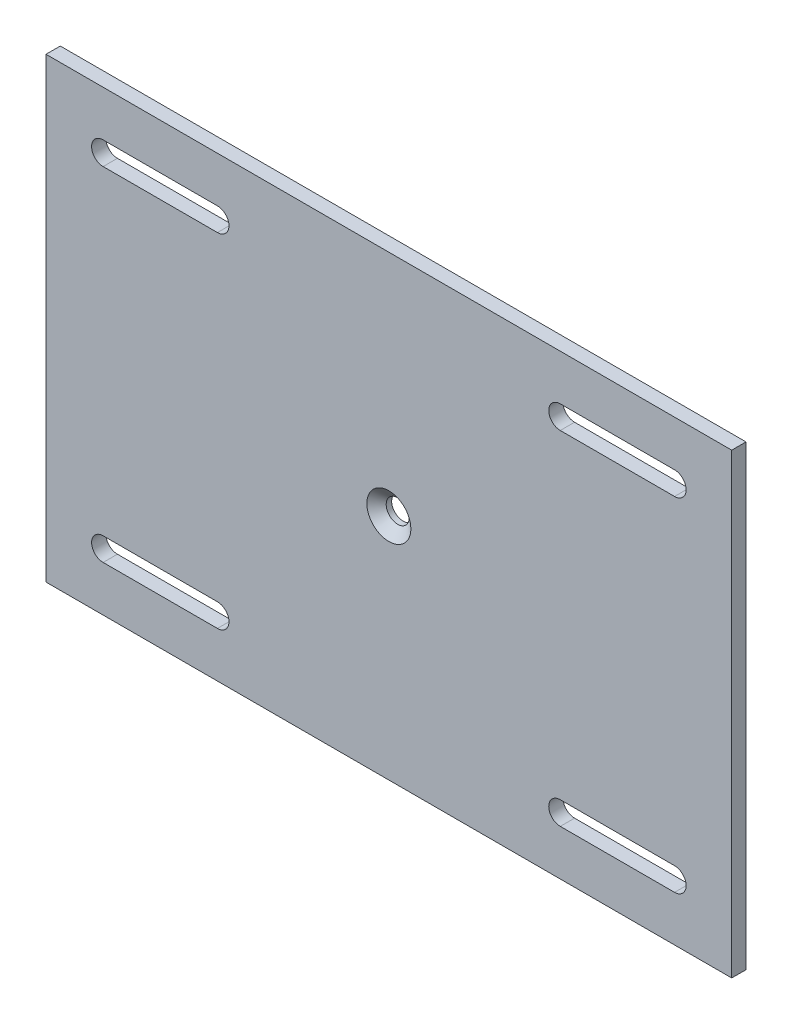
ISO-10303-21;
HEADER;
FILE_DESCRIPTION(('STEP AP214'),'2;1');
FILE_NAME('part.step','',(''),(''),'','','');
FILE_SCHEMA(('AUTOMOTIVE_DESIGN { 1 0 10303 214 1 1 1 1 }'));
ENDSEC;
DATA;
#1=APPLICATION_CONTEXT('core data for automotive mechanical design processes');
#2=APPLICATION_PROTOCOL_DEFINITION('international standard','automotive_design',2000,#1);
#3=PRODUCT_CONTEXT('',#1,'mechanical');
#4=PRODUCT('Part','Part','',(#3));
#5=PRODUCT_RELATED_PRODUCT_CATEGORY('part','',(#4));
#6=PRODUCT_DEFINITION_FORMATION('','',#4);
#7=PRODUCT_DEFINITION_CONTEXT('part definition',#1,'design');
#8=PRODUCT_DEFINITION('design','',#6,#7);
#9=PRODUCT_DEFINITION_SHAPE('','',#8);
#10=(LENGTH_UNIT() NAMED_UNIT(*) SI_UNIT(.MILLI.,.METRE.));
#11=(NAMED_UNIT(*) PLANE_ANGLE_UNIT() SI_UNIT($,.RADIAN.));
#12=(NAMED_UNIT(*) SI_UNIT($,.STERADIAN.) SOLID_ANGLE_UNIT());
#13=UNCERTAINTY_MEASURE_WITH_UNIT(LENGTH_MEASURE(1.E-05),#10,'distance_accuracy_value','');
#14=(GEOMETRIC_REPRESENTATION_CONTEXT(3) GLOBAL_UNCERTAINTY_ASSIGNED_CONTEXT((#13)) GLOBAL_UNIT_ASSIGNED_CONTEXT((#10,
#11,#12)) REPRESENTATION_CONTEXT('',''));
#15=CARTESIAN_POINT('',(0.,0.,0.));
#16=DIRECTION('',(0.,0.,1.));
#17=DIRECTION('',(1.,0.,0.));
#18=AXIS2_PLACEMENT_3D('',#15,#16,#17);
#19=CARTESIAN_POINT('',(0.,0.,3.175));
#20=DIRECTION('',(0.,0.,-1.));
#21=DIRECTION('',(-1.,0.,0.));
#22=AXIS2_PLACEMENT_3D('',#19,#20,#21);
#23=PLANE('',#22);
#24=CARTESIAN_POINT('',(0.,0.,3.175));
#25=DIRECTION('',(0.,0.,1.));
#26=DIRECTION('',(1.,0.,0.));
#27=AXIS2_PLACEMENT_3D('',#24,#25,#26);
#28=CIRCLE('',#27,4.8895);
#29=CARTESIAN_POINT('',(4.8895,0.,3.175));
#30=VERTEX_POINT('',#29);
#31=EDGE_CURVE('E645',#30,#30,#28,.T.);
#32=ORIENTED_EDGE('',*,*,#31,.F.);
#33=EDGE_LOOP('',(#32));
#34=FACE_BOUND('',#33,.T.);
#35=CARTESIAN_POINT('',(63.5,38.1,3.175));
#36=DIRECTION('',(0.,0.,1.));
#37=DIRECTION('',(1.,0.,0.));
#38=AXIS2_PLACEMENT_3D('',#35,#36,#37);
#39=CIRCLE('',#38,2.56593704644188);
#40=CARTESIAN_POINT('',(63.5,40.6659370464419,3.175));
#41=VERTEX_POINT('',#40);
#42=CARTESIAN_POINT('',(63.5,35.5340629535581,3.175));
#43=VERTEX_POINT('',#42);
#44=EDGE_CURVE('E285',#41,#43,#39,.F.);
#45=ORIENTED_EDGE('',*,*,#44,.T.);
#46=DIRECTION('',(-1.,0.,0.));
#47=VECTOR('',#46,1.);
#48=CARTESIAN_POINT('',(0.,35.5340629535581,3.175));
#49=LINE('',#48,#47);
#50=CARTESIAN_POINT('',(38.1,35.5340629535581,3.175));
#51=VERTEX_POINT('',#50);
#52=EDGE_CURVE('E369',#43,#51,#49,.T.);
#53=ORIENTED_EDGE('',*,*,#52,.T.);
#54=CARTESIAN_POINT('',(38.1,38.1,3.175));
#55=DIRECTION('',(0.,0.,1.));
#56=DIRECTION('',(1.,0.,0.));
#57=AXIS2_PLACEMENT_3D('',#54,#55,#56);
#58=CIRCLE('',#57,2.56593704644188);
#59=CARTESIAN_POINT('',(38.1,40.6659370464419,3.175));
#60=VERTEX_POINT('',#59);
#61=EDGE_CURVE('E365',#51,#60,#58,.F.);
#62=ORIENTED_EDGE('',*,*,#61,.T.);
#63=DIRECTION('',(-1.,0.,0.));
#64=VECTOR('',#63,1.);
#65=CARTESIAN_POINT('',(0.,40.6659370464419,3.175));
#66=LINE('',#65,#64);
#67=EDGE_CURVE('E269',#60,#41,#66,.F.);
#68=ORIENTED_EDGE('',*,*,#67,.T.);
#69=EDGE_LOOP('',(#45,#53,#62,#68));
#70=FACE_BOUND('',#69,.T.);
#71=DIRECTION('',(1.,0.,0.));
#72=VECTOR('',#71,1.);
#73=CARTESIAN_POINT('',(-63.5,35.5340629535581,3.175));
#74=LINE('',#73,#72);
#75=CARTESIAN_POINT('',(-63.5,35.5340629535581,3.175));
#76=VERTEX_POINT('',#75);
#77=CARTESIAN_POINT('',(-38.1,35.5340629535581,3.175));
#78=VERTEX_POINT('',#77);
#79=EDGE_CURVE('E307',#76,#78,#74,.T.);
#80=ORIENTED_EDGE('',*,*,#79,.F.);
#81=CARTESIAN_POINT('',(-63.5,38.1,3.175));
#82=DIRECTION('',(0.,0.,1.));
#83=DIRECTION('',(1.,0.,0.));
#84=AXIS2_PLACEMENT_3D('',#81,#82,#83);
#85=CIRCLE('',#84,2.56593704644188);
#86=CARTESIAN_POINT('',(-63.5,40.6659370464419,3.175));
#87=VERTEX_POINT('',#86);
#88=EDGE_CURVE('E333',#87,#76,#85,.T.);
#89=ORIENTED_EDGE('',*,*,#88,.F.);
#90=DIRECTION('',(-1.,0.,0.));
#91=VECTOR('',#90,1.);
#92=CARTESIAN_POINT('',(-63.5,40.6659370464419,3.175));
#93=LINE('',#92,#91);
#94=CARTESIAN_POINT('',(-38.1,40.6659370464419,3.175));
#95=VERTEX_POINT('',#94);
#96=EDGE_CURVE('E356',#95,#87,#93,.T.);
#97=ORIENTED_EDGE('',*,*,#96,.F.);
#98=CARTESIAN_POINT('',(-38.1,38.1,3.175));
#99=DIRECTION('',(0.,0.,1.));
#100=DIRECTION('',(1.,0.,0.));
#101=AXIS2_PLACEMENT_3D('',#98,#99,#100);
#102=CIRCLE('',#101,2.56593704644188);
#103=EDGE_CURVE('E353',#78,#95,#102,.T.);
#104=ORIENTED_EDGE('',*,*,#103,.F.);
#105=EDGE_LOOP('',(#80,#89,#97,#104));
#106=FACE_BOUND('',#105,.T.);
#107=DIRECTION('',(0.,1.,0.));
#108=VECTOR('',#107,1.);
#109=CARTESIAN_POINT('',(76.2,-50.8,3.175));
#110=LINE('',#109,#108);
#111=CARTESIAN_POINT('',(76.2,-50.8,3.175));
#112=VERTEX_POINT('',#111);
#113=CARTESIAN_POINT('',(76.2,50.8,3.175));
#114=VERTEX_POINT('',#113);
#115=EDGE_CURVE('E313',#112,#114,#110,.T.);
#116=ORIENTED_EDGE('',*,*,#115,.T.);
#117=DIRECTION('',(-1.,0.,0.));
#118=VECTOR('',#117,1.);
#119=CARTESIAN_POINT('',(-76.2,50.8,3.175));
#120=LINE('',#119,#118);
#121=CARTESIAN_POINT('',(-76.2,50.8,3.175));
#122=VERTEX_POINT('',#121);
#123=EDGE_CURVE('E317',#114,#122,#120,.T.);
#124=ORIENTED_EDGE('',*,*,#123,.T.);
#125=DIRECTION('',(0.,-1.,0.));
#126=VECTOR('',#125,1.);
#127=CARTESIAN_POINT('',(-76.2,-50.8,3.175));
#128=LINE('',#127,#126);
#129=CARTESIAN_POINT('',(-76.2,-50.8,3.175));
#130=VERTEX_POINT('',#129);
#131=EDGE_CURVE('E321',#122,#130,#128,.T.);
#132=ORIENTED_EDGE('',*,*,#131,.T.);
#133=DIRECTION('',(1.,0.,0.));
#134=VECTOR('',#133,1.);
#135=CARTESIAN_POINT('',(-76.2,-50.8,3.175));
#136=LINE('',#135,#134);
#137=EDGE_CURVE('E324',#130,#112,#136,.T.);
#138=ORIENTED_EDGE('',*,*,#137,.T.);
#139=EDGE_LOOP('',(#116,#124,#132,#138));
#140=FACE_BOUND('',#139,.T.);
#141=DIRECTION('',(-1.,0.,0.));
#142=VECTOR('',#141,1.);
#143=CARTESIAN_POINT('',(63.5,-35.5340629535581,3.175));
#144=LINE('',#143,#142);
#145=CARTESIAN_POINT('',(63.5,-35.5340629535581,3.175));
#146=VERTEX_POINT('',#145);
#147=CARTESIAN_POINT('',(38.1,-35.5340629535581,3.175));
#148=VERTEX_POINT('',#147);
#149=EDGE_CURVE('E244',#146,#148,#144,.T.);
#150=ORIENTED_EDGE('',*,*,#149,.F.);
#151=CARTESIAN_POINT('',(63.5,-38.1,3.175));
#152=DIRECTION('',(0.,0.,1.));
#153=DIRECTION('',(1.,0.,0.));
#154=AXIS2_PLACEMENT_3D('',#151,#152,#153);
#155=CIRCLE('',#154,2.56593704644188);
#156=CARTESIAN_POINT('',(63.5,-40.6659370464419,3.175));
#157=VERTEX_POINT('',#156);
#158=EDGE_CURVE('E254',#157,#146,#155,.T.);
#159=ORIENTED_EDGE('',*,*,#158,.F.);
#160=DIRECTION('',(1.,0.,0.));
#161=VECTOR('',#160,1.);
#162=CARTESIAN_POINT('',(63.5,-40.6659370464419,3.175));
#163=LINE('',#162,#161);
#164=CARTESIAN_POINT('',(38.1,-40.6659370464419,3.175));
#165=VERTEX_POINT('',#164);
#166=EDGE_CURVE('E381',#165,#157,#163,.T.);
#167=ORIENTED_EDGE('',*,*,#166,.F.);
#168=CARTESIAN_POINT('',(38.1,-38.1,3.175));
#169=DIRECTION('',(0.,0.,1.));
#170=DIRECTION('',(1.,0.,0.));
#171=AXIS2_PLACEMENT_3D('',#168,#169,#170);
#172=CIRCLE('',#171,2.56593704644188);
#173=EDGE_CURVE('E378',#148,#165,#172,.T.);
#174=ORIENTED_EDGE('',*,*,#173,.F.);
#175=EDGE_LOOP('',(#150,#159,#167,#174));
#176=FACE_BOUND('',#175,.T.);
#177=CARTESIAN_POINT('',(-63.5,-38.1,3.175));
#178=DIRECTION('',(0.,0.,1.));
#179=DIRECTION('',(1.,0.,0.));
#180=AXIS2_PLACEMENT_3D('',#177,#178,#179);
#181=CIRCLE('',#180,2.56593704644188);
#182=CARTESIAN_POINT('',(-63.5,-40.6659370464419,3.175));
#183=VERTEX_POINT('',#182);
#184=CARTESIAN_POINT('',(-63.5,-35.5340629535581,3.175));
#185=VERTEX_POINT('',#184);
#186=EDGE_CURVE('E43',#183,#185,#181,.F.);
#187=ORIENTED_EDGE('',*,*,#186,.T.);
#188=DIRECTION('',(-1.,0.,0.));
#189=VECTOR('',#188,1.);
#190=CARTESIAN_POINT('',(0.,-35.5340629535581,3.175));
#191=LINE('',#190,#189);
#192=CARTESIAN_POINT('',(-38.1,-35.5340629535581,3.175));
#193=VERTEX_POINT('',#192);
#194=EDGE_CURVE('E392',#185,#193,#191,.F.);
#195=ORIENTED_EDGE('',*,*,#194,.T.);
#196=CARTESIAN_POINT('',(-38.1,-38.1,3.175));
#197=DIRECTION('',(0.,0.,1.));
#198=DIRECTION('',(1.,0.,0.));
#199=AXIS2_PLACEMENT_3D('',#196,#197,#198);
#200=CIRCLE('',#199,2.56593704644188);
#201=CARTESIAN_POINT('',(-38.1,-40.6659370464419,3.175));
#202=VERTEX_POINT('',#201);
#203=EDGE_CURVE('E389',#193,#202,#200,.F.);
#204=ORIENTED_EDGE('',*,*,#203,.T.);
#205=DIRECTION('',(-1.,0.,0.));
#206=VECTOR('',#205,1.);
#207=CARTESIAN_POINT('',(0.,-40.6659370464419,3.175));
#208=LINE('',#207,#206);
#209=EDGE_CURVE('E211',#202,#183,#208,.T.);
#210=ORIENTED_EDGE('',*,*,#209,.T.);
#211=EDGE_LOOP('',(#187,#195,#204,#210));
#212=FACE_BOUND('',#211,.T.);
#213=ADVANCED_FACE('F39',(#34,#70,#106,#140,#176,#212),#23,.F.);
#214=CARTESIAN_POINT('',(0.,0.,0.));
#215=DIRECTION('',(0.,0.,-1.));
#216=DIRECTION('',(-1.,0.,0.));
#217=AXIS2_PLACEMENT_3D('',#214,#215,#216);
#218=PLANE('',#217);
#219=CARTESIAN_POINT('',(0.,0.,0.));
#220=DIRECTION('',(0.,0.,1.));
#221=DIRECTION('',(1.,0.,0.));
#222=AXIS2_PLACEMENT_3D('',#219,#220,#221);
#223=CIRCLE('',#222,2.5527);
#224=CARTESIAN_POINT('',(2.5527,0.,0.));
#225=VERTEX_POINT('',#224);
#226=EDGE_CURVE('E196',#225,#225,#223,.T.);
#227=ORIENTED_EDGE('',*,*,#226,.T.);
#228=EDGE_LOOP('',(#227));
#229=FACE_BOUND('',#228,.T.);
#230=CARTESIAN_POINT('',(63.5,-38.1,0.));
#231=DIRECTION('',(0.,0.,1.));
#232=DIRECTION('',(-1.,0.,0.));
#233=AXIS2_PLACEMENT_3D('',#230,#231,#232);
#234=CIRCLE('',#233,2.56593704644188);
#235=CARTESIAN_POINT('',(63.5,-40.6659370464419,0.));
#236=VERTEX_POINT('',#235);
#237=CARTESIAN_POINT('',(63.5,-35.5340629535581,0.));
#238=VERTEX_POINT('',#237);
#239=EDGE_CURVE('E218',#236,#238,#234,.T.);
#240=ORIENTED_EDGE('',*,*,#239,.T.);
#241=DIRECTION('',(-1.,0.,0.));
#242=VECTOR('',#241,1.);
#243=CARTESIAN_POINT('',(63.5,-35.5340629535581,0.));
#244=LINE('',#243,#242);
#245=CARTESIAN_POINT('',(38.1,-35.5340629535581,0.));
#246=VERTEX_POINT('',#245);
#247=EDGE_CURVE('E222',#238,#246,#244,.T.);
#248=ORIENTED_EDGE('',*,*,#247,.T.);
#249=CARTESIAN_POINT('',(38.1,-38.1,0.));
#250=DIRECTION('',(0.,0.,1.));
#251=DIRECTION('',(-1.,0.,0.));
#252=AXIS2_PLACEMENT_3D('',#249,#250,#251);
#253=CIRCLE('',#252,2.56593704644188);
#254=CARTESIAN_POINT('',(38.1,-40.6659370464419,0.));
#255=VERTEX_POINT('',#254);
#256=EDGE_CURVE('E226',#246,#255,#253,.T.);
#257=ORIENTED_EDGE('',*,*,#256,.T.);
#258=DIRECTION('',(1.,0.,0.));
#259=VECTOR('',#258,1.);
#260=CARTESIAN_POINT('',(63.5,-40.6659370464419,0.));
#261=LINE('',#260,#259);
#262=EDGE_CURVE('E230',#255,#236,#261,.T.);
#263=ORIENTED_EDGE('',*,*,#262,.T.);
#264=EDGE_LOOP('',(#240,#248,#257,#263));
#265=FACE_BOUND('',#264,.T.);
#266=CARTESIAN_POINT('',(-63.5,38.1,0.));
#267=DIRECTION('',(0.,0.,1.));
#268=DIRECTION('',(1.,0.,0.));
#269=AXIS2_PLACEMENT_3D('',#266,#267,#268);
#270=CIRCLE('',#269,2.56593704644188);
#271=CARTESIAN_POINT('',(-63.5,40.6659370464419,0.));
#272=VERTEX_POINT('',#271);
#273=CARTESIAN_POINT('',(-63.5,35.5340629535581,0.));
#274=VERTEX_POINT('',#273);
#275=EDGE_CURVE('E280',#272,#274,#270,.T.);
#276=ORIENTED_EDGE('',*,*,#275,.T.);
#277=DIRECTION('',(1.,0.,0.));
#278=VECTOR('',#277,1.);
#279=CARTESIAN_POINT('',(-63.5,35.5340629535581,0.));
#280=LINE('',#279,#278);
#281=CARTESIAN_POINT('',(-38.1,35.5340629535581,0.));
#282=VERTEX_POINT('',#281);
#283=EDGE_CURVE('E284',#274,#282,#280,.T.);
#284=ORIENTED_EDGE('',*,*,#283,.T.);
#285=CARTESIAN_POINT('',(-38.1,38.1,0.));
#286=DIRECTION('',(0.,0.,1.));
#287=DIRECTION('',(1.,0.,0.));
#288=AXIS2_PLACEMENT_3D('',#285,#286,#287);
#289=CIRCLE('',#288,2.56593704644188);
#290=CARTESIAN_POINT('',(-38.1,40.6659370464419,0.));
#291=VERTEX_POINT('',#290);
#292=EDGE_CURVE('E289',#282,#291,#289,.T.);
#293=ORIENTED_EDGE('',*,*,#292,.T.);
#294=DIRECTION('',(-1.,0.,0.));
#295=VECTOR('',#294,1.);
#296=CARTESIAN_POINT('',(-63.5,40.6659370464419,0.));
#297=LINE('',#296,#295);
#298=EDGE_CURVE('E293',#291,#272,#297,.T.);
#299=ORIENTED_EDGE('',*,*,#298,.T.);
#300=EDGE_LOOP('',(#276,#284,#293,#299));
#301=FACE_BOUND('',#300,.T.);
#302=DIRECTION('',(0.,1.,0.));
#303=VECTOR('',#302,1.);
#304=CARTESIAN_POINT('',(76.2,-50.8,0.));
#305=LINE('',#304,#303);
#306=CARTESIAN_POINT('',(76.2,-50.8,0.));
#307=VERTEX_POINT('',#306);
#308=CARTESIAN_POINT('',(76.2,50.8,0.));
#309=VERTEX_POINT('',#308);
#310=EDGE_CURVE('E328',#307,#309,#305,.T.);
#311=ORIENTED_EDGE('',*,*,#310,.F.);
#312=DIRECTION('',(1.,0.,0.));
#313=VECTOR('',#312,1.);
#314=CARTESIAN_POINT('',(-76.2,-50.8,0.));
#315=LINE('',#314,#313);
#316=CARTESIAN_POINT('',(-76.2,-50.8,0.));
#317=VERTEX_POINT('',#316);
#318=EDGE_CURVE('E318',#317,#307,#315,.T.);
#319=ORIENTED_EDGE('',*,*,#318,.F.);
#320=DIRECTION('',(0.,-1.,0.));
#321=VECTOR('',#320,1.);
#322=CARTESIAN_POINT('',(-76.2,-50.8,0.));
#323=LINE('',#322,#321);
#324=CARTESIAN_POINT('',(-76.2,50.8,0.));
#325=VERTEX_POINT('',#324);
#326=EDGE_CURVE('E336',#325,#317,#323,.T.);
#327=ORIENTED_EDGE('',*,*,#326,.F.);
#328=DIRECTION('',(-1.,0.,0.));
#329=VECTOR('',#328,1.);
#330=CARTESIAN_POINT('',(-76.2,50.8,0.));
#331=LINE('',#330,#329);
#332=EDGE_CURVE('E332',#309,#325,#331,.T.);
#333=ORIENTED_EDGE('',*,*,#332,.F.);
#334=EDGE_LOOP('',(#311,#319,#327,#333));
#335=FACE_BOUND('',#334,.T.);
#336=DIRECTION('',(-1.,0.,0.));
#337=VECTOR('',#336,1.);
#338=CARTESIAN_POINT('',(63.5,35.5340629535581,0.));
#339=LINE('',#338,#337);
#340=CARTESIAN_POINT('',(63.5,35.5340629535581,0.));
#341=VERTEX_POINT('',#340);
#342=CARTESIAN_POINT('',(38.1,35.5340629535581,0.));
#343=VERTEX_POINT('',#342);
#344=EDGE_CURVE('E261',#341,#343,#339,.T.);
#345=ORIENTED_EDGE('',*,*,#344,.F.);
#346=CARTESIAN_POINT('',(63.5,38.1,0.));
#347=DIRECTION('',(0.,0.,-1.));
#348=DIRECTION('',(-1.,0.,0.));
#349=AXIS2_PLACEMENT_3D('',#346,#347,#348);
#350=CIRCLE('',#349,2.56593704644188);
#351=CARTESIAN_POINT('',(63.5,40.6659370464419,0.));
#352=VERTEX_POINT('',#351);
#353=EDGE_CURVE('E250',#352,#341,#350,.T.);
#354=ORIENTED_EDGE('',*,*,#353,.F.);
#355=DIRECTION('',(1.,0.,0.));
#356=VECTOR('',#355,1.);
#357=CARTESIAN_POINT('',(63.5,40.6659370464419,0.));
#358=LINE('',#357,#356);
#359=CARTESIAN_POINT('',(38.1,40.6659370464419,0.));
#360=VERTEX_POINT('',#359);
#361=EDGE_CURVE('E253',#360,#352,#358,.T.);
#362=ORIENTED_EDGE('',*,*,#361,.F.);
#363=CARTESIAN_POINT('',(38.1,38.1,0.));
#364=DIRECTION('',(0.,0.,-1.));
#365=DIRECTION('',(-1.,0.,0.));
#366=AXIS2_PLACEMENT_3D('',#363,#364,#365);
#367=CIRCLE('',#366,2.56593704644188);
#368=EDGE_CURVE('E257',#343,#360,#367,.T.);
#369=ORIENTED_EDGE('',*,*,#368,.F.);
#370=EDGE_LOOP('',(#345,#354,#362,#369));
#371=FACE_BOUND('',#370,.T.);
#372=DIRECTION('',(1.,0.,0.));
#373=VECTOR('',#372,1.);
#374=CARTESIAN_POINT('',(-63.5,-35.5340629535581,0.));
#375=LINE('',#374,#373);
#376=CARTESIAN_POINT('',(-63.5,-35.5340629535581,0.));
#377=VERTEX_POINT('',#376);
#378=CARTESIAN_POINT('',(-38.1,-35.5340629535581,0.));
#379=VERTEX_POINT('',#378);
#380=EDGE_CURVE('E191',#377,#379,#375,.T.);
#381=ORIENTED_EDGE('',*,*,#380,.F.);
#382=CARTESIAN_POINT('',(-63.5,-38.1,0.));
#383=DIRECTION('',(0.,0.,-1.));
#384=DIRECTION('',(1.,0.,0.));
#385=AXIS2_PLACEMENT_3D('',#382,#383,#384);
#386=CIRCLE('',#385,2.56593704644188);
#387=CARTESIAN_POINT('',(-63.5,-40.6659370464419,0.));
#388=VERTEX_POINT('',#387);
#389=EDGE_CURVE('E182',#388,#377,#386,.T.);
#390=ORIENTED_EDGE('',*,*,#389,.F.);
#391=DIRECTION('',(-1.,0.,0.));
#392=VECTOR('',#391,1.);
#393=CARTESIAN_POINT('',(-63.5,-40.6659370464419,0.));
#394=LINE('',#393,#392);
#395=CARTESIAN_POINT('',(-38.1,-40.6659370464419,0.));
#396=VERTEX_POINT('',#395);
#397=EDGE_CURVE('E172',#396,#388,#394,.T.);
#398=ORIENTED_EDGE('',*,*,#397,.F.);
#399=CARTESIAN_POINT('',(-38.1,-38.1,0.));
#400=DIRECTION('',(0.,0.,-1.));
#401=DIRECTION('',(1.,0.,0.));
#402=AXIS2_PLACEMENT_3D('',#399,#400,#401);
#403=CIRCLE('',#402,2.56593704644188);
#404=EDGE_CURVE('E181',#379,#396,#403,.T.);
#405=ORIENTED_EDGE('',*,*,#404,.F.);
#406=EDGE_LOOP('',(#381,#390,#398,#405));
#407=FACE_BOUND('',#406,.T.);
#408=ADVANCED_FACE('F194',(#229,#265,#301,#335,#371,#407),#218,.T.);
#409=CARTESIAN_POINT('',(76.2,-50.8,3.175));
#410=DIRECTION('',(-1.,0.,0.));
#411=DIRECTION('',(0.,0.,1.));
#412=AXIS2_PLACEMENT_3D('',#409,#410,#411);
#413=PLANE('',#412);
#414=ORIENTED_EDGE('',*,*,#310,.T.);
#415=DIRECTION('',(0.,0.,-1.));
#416=VECTOR('',#415,1.);
#417=CARTESIAN_POINT('',(76.2,50.8,3.175));
#418=LINE('',#417,#416);
#419=EDGE_CURVE('E11',#114,#309,#418,.T.);
#420=ORIENTED_EDGE('',*,*,#419,.F.);
#421=ORIENTED_EDGE('',*,*,#115,.F.);
#422=DIRECTION('',(0.,0.,-1.));
#423=VECTOR('',#422,1.);
#424=CARTESIAN_POINT('',(76.2,-50.8,3.175));
#425=LINE('',#424,#423);
#426=EDGE_CURVE('E327',#112,#307,#425,.T.);
#427=ORIENTED_EDGE('',*,*,#426,.T.);
#428=EDGE_LOOP('',(#414,#420,#421,#427));
#429=FACE_BOUND('',#428,.T.);
#430=ADVANCED_FACE('F41',(#429),#413,.F.);
#431=CARTESIAN_POINT('',(-76.2,50.8,3.175));
#432=DIRECTION('',(0.,-1.,0.));
#433=DIRECTION('',(0.,0.,-1.));
#434=AXIS2_PLACEMENT_3D('',#431,#432,#433);
#435=PLANE('',#434);
#436=ORIENTED_EDGE('',*,*,#332,.T.);
#437=DIRECTION('',(0.,0.,-1.));
#438=VECTOR('',#437,1.);
#439=CARTESIAN_POINT('',(-76.2,50.8,3.175));
#440=LINE('',#439,#438);
#441=EDGE_CURVE('E50',#122,#325,#440,.T.);
#442=ORIENTED_EDGE('',*,*,#441,.F.);
#443=ORIENTED_EDGE('',*,*,#123,.F.);
#444=ORIENTED_EDGE('',*,*,#419,.T.);
#445=EDGE_LOOP('',(#436,#442,#443,#444));
#446=FACE_BOUND('',#445,.T.);
#447=ADVANCED_FACE('F432',(#446),#435,.F.);
#448=CARTESIAN_POINT('',(-76.2,-50.8,3.175));
#449=DIRECTION('',(1.,0.,0.));
#450=DIRECTION('',(0.,0.,-1.));
#451=AXIS2_PLACEMENT_3D('',#448,#449,#450);
#452=PLANE('',#451);
#453=ORIENTED_EDGE('',*,*,#326,.T.);
#454=DIRECTION('',(0.,0.,-1.));
#455=VECTOR('',#454,1.);
#456=CARTESIAN_POINT('',(-76.2,-50.8,3.175));
#457=LINE('',#456,#455);
#458=EDGE_CURVE('E344',#130,#317,#457,.T.);
#459=ORIENTED_EDGE('',*,*,#458,.F.);
#460=ORIENTED_EDGE('',*,*,#131,.F.);
#461=ORIENTED_EDGE('',*,*,#441,.T.);
#462=EDGE_LOOP('',(#453,#459,#460,#461));
#463=FACE_BOUND('',#462,.T.);
#464=ADVANCED_FACE('F429',(#463),#452,.F.);
#465=CARTESIAN_POINT('',(-76.2,-50.8,3.175));
#466=DIRECTION('',(0.,1.,0.));
#467=DIRECTION('',(0.,0.,1.));
#468=AXIS2_PLACEMENT_3D('',#465,#466,#467);
#469=PLANE('',#468);
#470=ORIENTED_EDGE('',*,*,#318,.T.);
#471=ORIENTED_EDGE('',*,*,#426,.F.);
#472=ORIENTED_EDGE('',*,*,#137,.F.);
#473=ORIENTED_EDGE('',*,*,#458,.T.);
#474=EDGE_LOOP('',(#470,#471,#472,#473));
#475=FACE_BOUND('',#474,.T.);
#476=ADVANCED_FACE('F426',(#475),#469,.F.);
#477=CARTESIAN_POINT('',(-63.5,38.1,0.));
#478=DIRECTION('',(0.,0.,1.));
#479=DIRECTION('',(1.,0.,0.));
#480=AXIS2_PLACEMENT_3D('',#477,#478,#479);
#481=CYLINDRICAL_SURFACE('',#480,2.56593704644188);
#482=DIRECTION('',(0.,0.,1.));
#483=VECTOR('',#482,1.);
#484=CARTESIAN_POINT('',(-63.5,35.5340629535581,0.));
#485=LINE('',#484,#483);
#486=EDGE_CURVE('E297',#274,#76,#485,.T.);
#487=ORIENTED_EDGE('',*,*,#486,.F.);
#488=ORIENTED_EDGE('',*,*,#275,.F.);
#489=DIRECTION('',(0.,0.,1.));
#490=VECTOR('',#489,1.);
#491=CARTESIAN_POINT('',(-63.5,40.6659370464419,0.));
#492=LINE('',#491,#490);
#493=EDGE_CURVE('E302',#272,#87,#492,.T.);
#494=ORIENTED_EDGE('',*,*,#493,.T.);
#495=ORIENTED_EDGE('',*,*,#88,.T.);
#496=EDGE_LOOP('',(#487,#488,#494,#495));
#497=FACE_BOUND('',#496,.T.);
#498=ADVANCED_FACE('F423',(#497),#481,.F.);
#499=CARTESIAN_POINT('',(-63.5,40.6659370464419,0.));
#500=DIRECTION('',(0.,1.,0.));
#501=DIRECTION('',(-1.,0.,0.));
#502=AXIS2_PLACEMENT_3D('',#499,#500,#501);
#503=PLANE('',#502);
#504=ORIENTED_EDGE('',*,*,#493,.F.);
#505=ORIENTED_EDGE('',*,*,#298,.F.);
#506=DIRECTION('',(0.,0.,1.));
#507=VECTOR('',#506,1.);
#508=CARTESIAN_POINT('',(-38.1,40.6659370464419,0.));
#509=LINE('',#508,#507);
#510=EDGE_CURVE('E298',#291,#95,#509,.T.);
#511=ORIENTED_EDGE('',*,*,#510,.T.);
#512=ORIENTED_EDGE('',*,*,#96,.T.);
#513=EDGE_LOOP('',(#504,#505,#511,#512));
#514=FACE_BOUND('',#513,.T.);
#515=ADVANCED_FACE('F501',(#514),#503,.F.);
#516=CARTESIAN_POINT('',(-38.1,38.1,0.));
#517=DIRECTION('',(0.,0.,1.));
#518=DIRECTION('',(1.,0.,0.));
#519=AXIS2_PLACEMENT_3D('',#516,#517,#518);
#520=CYLINDRICAL_SURFACE('',#519,2.56593704644188);
#521=ORIENTED_EDGE('',*,*,#510,.F.);
#522=ORIENTED_EDGE('',*,*,#292,.F.);
#523=DIRECTION('',(0.,0.,1.));
#524=VECTOR('',#523,1.);
#525=CARTESIAN_POINT('',(-38.1,35.5340629535581,0.));
#526=LINE('',#525,#524);
#527=EDGE_CURVE('E303',#282,#78,#526,.T.);
#528=ORIENTED_EDGE('',*,*,#527,.T.);
#529=ORIENTED_EDGE('',*,*,#103,.T.);
#530=EDGE_LOOP('',(#521,#522,#528,#529));
#531=FACE_BOUND('',#530,.T.);
#532=ADVANCED_FACE('F504',(#531),#520,.F.);
#533=CARTESIAN_POINT('',(-63.5,35.5340629535581,0.));
#534=DIRECTION('',(0.,-1.,0.));
#535=DIRECTION('',(1.,0.,0.));
#536=AXIS2_PLACEMENT_3D('',#533,#534,#535);
#537=PLANE('',#536);
#538=ORIENTED_EDGE('',*,*,#527,.F.);
#539=ORIENTED_EDGE('',*,*,#283,.F.);
#540=ORIENTED_EDGE('',*,*,#486,.T.);
#541=ORIENTED_EDGE('',*,*,#79,.T.);
#542=EDGE_LOOP('',(#538,#539,#540,#541));
#543=FACE_BOUND('',#542,.T.);
#544=ADVANCED_FACE('F499',(#543),#537,.F.);
#545=CARTESIAN_POINT('',(63.5,38.1,0.));
#546=DIRECTION('',(0.,0.,1.));
#547=DIRECTION('',(1.,0.,0.));
#548=AXIS2_PLACEMENT_3D('',#545,#546,#547);
#549=CYLINDRICAL_SURFACE('',#548,2.56593704644188);
#550=ORIENTED_EDGE('',*,*,#44,.F.);
#551=DIRECTION('',(0.,0.,1.));
#552=VECTOR('',#551,1.);
#553=CARTESIAN_POINT('',(63.5,40.6659370464419,0.));
#554=LINE('',#553,#552);
#555=EDGE_CURVE('E264',#352,#41,#554,.T.);
#556=ORIENTED_EDGE('',*,*,#555,.F.);
#557=ORIENTED_EDGE('',*,*,#353,.T.);
#558=DIRECTION('',(0.,0.,1.));
#559=VECTOR('',#558,1.);
#560=CARTESIAN_POINT('',(63.5,35.5340629535581,0.));
#561=LINE('',#560,#559);
#562=EDGE_CURVE('E265',#341,#43,#561,.T.);
#563=ORIENTED_EDGE('',*,*,#562,.T.);
#564=EDGE_LOOP('',(#550,#556,#557,#563));
#565=FACE_BOUND('',#564,.T.);
#566=ADVANCED_FACE('F489',(#565),#549,.F.);
#567=CARTESIAN_POINT('',(63.5,35.5340629535581,0.));
#568=DIRECTION('',(0.,1.,0.));
#569=DIRECTION('',(-1.,0.,0.));
#570=AXIS2_PLACEMENT_3D('',#567,#568,#569);
#571=PLANE('',#570);
#572=ORIENTED_EDGE('',*,*,#52,.F.);
#573=ORIENTED_EDGE('',*,*,#562,.F.);
#574=ORIENTED_EDGE('',*,*,#344,.T.);
#575=DIRECTION('',(0.,0.,1.));
#576=VECTOR('',#575,1.);
#577=CARTESIAN_POINT('',(38.1,35.5340629535581,0.));
#578=LINE('',#577,#576);
#579=EDGE_CURVE('E270',#343,#51,#578,.T.);
#580=ORIENTED_EDGE('',*,*,#579,.T.);
#581=EDGE_LOOP('',(#572,#573,#574,#580));
#582=FACE_BOUND('',#581,.T.);
#583=ADVANCED_FACE('F485',(#582),#571,.T.);
#584=CARTESIAN_POINT('',(38.1,38.1,0.));
#585=DIRECTION('',(0.,0.,1.));
#586=DIRECTION('',(1.,0.,0.));
#587=AXIS2_PLACEMENT_3D('',#584,#585,#586);
#588=CYLINDRICAL_SURFACE('',#587,2.56593704644188);
#589=ORIENTED_EDGE('',*,*,#61,.F.);
#590=ORIENTED_EDGE('',*,*,#579,.F.);
#591=ORIENTED_EDGE('',*,*,#368,.T.);
#592=DIRECTION('',(0.,0.,1.));
#593=VECTOR('',#592,1.);
#594=CARTESIAN_POINT('',(38.1,40.6659370464419,0.));
#595=LINE('',#594,#593);
#596=EDGE_CURVE('E274',#360,#60,#595,.T.);
#597=ORIENTED_EDGE('',*,*,#596,.T.);
#598=EDGE_LOOP('',(#589,#590,#591,#597));
#599=FACE_BOUND('',#598,.T.);
#600=ADVANCED_FACE('F488',(#599),#588,.F.);
#601=CARTESIAN_POINT('',(63.5,40.6659370464419,0.));
#602=DIRECTION('',(0.,-1.,0.));
#603=DIRECTION('',(1.,0.,0.));
#604=AXIS2_PLACEMENT_3D('',#601,#602,#603);
#605=PLANE('',#604);
#606=ORIENTED_EDGE('',*,*,#67,.F.);
#607=ORIENTED_EDGE('',*,*,#596,.F.);
#608=ORIENTED_EDGE('',*,*,#361,.T.);
#609=ORIENTED_EDGE('',*,*,#555,.T.);
#610=EDGE_LOOP('',(#606,#607,#608,#609));
#611=FACE_BOUND('',#610,.T.);
#612=ADVANCED_FACE('F479',(#611),#605,.T.);
#613=CARTESIAN_POINT('',(63.5,-38.1,0.));
#614=DIRECTION('',(0.,0.,1.));
#615=DIRECTION('',(1.,0.,0.));
#616=AXIS2_PLACEMENT_3D('',#613,#614,#615);
#617=CYLINDRICAL_SURFACE('',#616,2.56593704644188);
#618=DIRECTION('',(0.,0.,1.));
#619=VECTOR('',#618,1.);
#620=CARTESIAN_POINT('',(63.5,-35.5340629535581,0.));
#621=LINE('',#620,#619);
#622=EDGE_CURVE('E234',#238,#146,#621,.T.);
#623=ORIENTED_EDGE('',*,*,#622,.F.);
#624=ORIENTED_EDGE('',*,*,#239,.F.);
#625=DIRECTION('',(0.,0.,1.));
#626=VECTOR('',#625,1.);
#627=CARTESIAN_POINT('',(63.5,-40.6659370464419,0.));
#628=LINE('',#627,#626);
#629=EDGE_CURVE('E239',#236,#157,#628,.T.);
#630=ORIENTED_EDGE('',*,*,#629,.T.);
#631=ORIENTED_EDGE('',*,*,#158,.T.);
#632=EDGE_LOOP('',(#623,#624,#630,#631));
#633=FACE_BOUND('',#632,.T.);
#634=ADVANCED_FACE('F469',(#633),#617,.F.);
#635=CARTESIAN_POINT('',(63.5,-40.6659370464419,0.));
#636=DIRECTION('',(0.,-1.,0.));
#637=DIRECTION('',(1.,0.,0.));
#638=AXIS2_PLACEMENT_3D('',#635,#636,#637);
#639=PLANE('',#638);
#640=ORIENTED_EDGE('',*,*,#629,.F.);
#641=ORIENTED_EDGE('',*,*,#262,.F.);
#642=DIRECTION('',(0.,0.,1.));
#643=VECTOR('',#642,1.);
#644=CARTESIAN_POINT('',(38.1,-40.6659370464419,0.));
#645=LINE('',#644,#643);
#646=EDGE_CURVE('E235',#255,#165,#645,.T.);
#647=ORIENTED_EDGE('',*,*,#646,.T.);
#648=ORIENTED_EDGE('',*,*,#166,.T.);
#649=EDGE_LOOP('',(#640,#641,#647,#648));
#650=FACE_BOUND('',#649,.T.);
#651=ADVANCED_FACE('F471',(#650),#639,.F.);
#652=CARTESIAN_POINT('',(38.1,-38.1,0.));
#653=DIRECTION('',(0.,0.,1.));
#654=DIRECTION('',(1.,0.,0.));
#655=AXIS2_PLACEMENT_3D('',#652,#653,#654);
#656=CYLINDRICAL_SURFACE('',#655,2.56593704644188);
#657=ORIENTED_EDGE('',*,*,#646,.F.);
#658=ORIENTED_EDGE('',*,*,#256,.F.);
#659=DIRECTION('',(0.,0.,1.));
#660=VECTOR('',#659,1.);
#661=CARTESIAN_POINT('',(38.1,-35.5340629535581,0.));
#662=LINE('',#661,#660);
#663=EDGE_CURVE('E240',#246,#148,#662,.T.);
#664=ORIENTED_EDGE('',*,*,#663,.T.);
#665=ORIENTED_EDGE('',*,*,#173,.T.);
#666=EDGE_LOOP('',(#657,#658,#664,#665));
#667=FACE_BOUND('',#666,.T.);
#668=ADVANCED_FACE('F463',(#667),#656,.F.);
#669=CARTESIAN_POINT('',(63.5,-35.5340629535581,0.));
#670=DIRECTION('',(0.,1.,0.));
#671=DIRECTION('',(-1.,0.,0.));
#672=AXIS2_PLACEMENT_3D('',#669,#670,#671);
#673=PLANE('',#672);
#674=ORIENTED_EDGE('',*,*,#663,.F.);
#675=ORIENTED_EDGE('',*,*,#247,.F.);
#676=ORIENTED_EDGE('',*,*,#622,.T.);
#677=ORIENTED_EDGE('',*,*,#149,.T.);
#678=EDGE_LOOP('',(#674,#675,#676,#677));
#679=FACE_BOUND('',#678,.T.);
#680=ADVANCED_FACE('F460',(#679),#673,.F.);
#681=CARTESIAN_POINT('',(-63.5,-38.1,0.));
#682=DIRECTION('',(0.,0.,1.));
#683=DIRECTION('',(1.,0.,0.));
#684=AXIS2_PLACEMENT_3D('',#681,#682,#683);
#685=CYLINDRICAL_SURFACE('',#684,2.56593704644188);
#686=ORIENTED_EDGE('',*,*,#186,.F.);
#687=DIRECTION('',(0.,0.,1.));
#688=VECTOR('',#687,1.);
#689=CARTESIAN_POINT('',(-63.5,-40.6659370464419,0.));
#690=LINE('',#689,#688);
#691=EDGE_CURVE('E58',#388,#183,#690,.T.);
#692=ORIENTED_EDGE('',*,*,#691,.F.);
#693=ORIENTED_EDGE('',*,*,#389,.T.);
#694=DIRECTION('',(0.,0.,1.));
#695=VECTOR('',#694,1.);
#696=CARTESIAN_POINT('',(-63.5,-35.5340629535581,0.));
#697=LINE('',#696,#695);
#698=EDGE_CURVE('E208',#377,#185,#697,.T.);
#699=ORIENTED_EDGE('',*,*,#698,.T.);
#700=EDGE_LOOP('',(#686,#692,#693,#699));
#701=FACE_BOUND('',#700,.T.);
#702=ADVANCED_FACE('F185',(#701),#685,.F.);
#703=CARTESIAN_POINT('',(-63.5,-35.5340629535581,0.));
#704=DIRECTION('',(0.,-1.,0.));
#705=DIRECTION('',(1.,0.,0.));
#706=AXIS2_PLACEMENT_3D('',#703,#704,#705);
#707=PLANE('',#706);
#708=ORIENTED_EDGE('',*,*,#194,.F.);
#709=ORIENTED_EDGE('',*,*,#698,.F.);
#710=ORIENTED_EDGE('',*,*,#380,.T.);
#711=DIRECTION('',(0.,0.,1.));
#712=VECTOR('',#711,1.);
#713=CARTESIAN_POINT('',(-38.1,-35.5340629535581,0.));
#714=LINE('',#713,#712);
#715=EDGE_CURVE('E212',#379,#193,#714,.T.);
#716=ORIENTED_EDGE('',*,*,#715,.T.);
#717=EDGE_LOOP('',(#708,#709,#710,#716));
#718=FACE_BOUND('',#717,.T.);
#719=ADVANCED_FACE('F399',(#718),#707,.T.);
#720=CARTESIAN_POINT('',(-38.1,-38.1,0.));
#721=DIRECTION('',(0.,0.,1.));
#722=DIRECTION('',(1.,0.,0.));
#723=AXIS2_PLACEMENT_3D('',#720,#721,#722);
#724=CYLINDRICAL_SURFACE('',#723,2.56593704644188);
#725=ORIENTED_EDGE('',*,*,#203,.F.);
#726=ORIENTED_EDGE('',*,*,#715,.F.);
#727=ORIENTED_EDGE('',*,*,#404,.T.);
#728=DIRECTION('',(0.,0.,1.));
#729=VECTOR('',#728,1.);
#730=CARTESIAN_POINT('',(-38.1,-40.6659370464419,0.));
#731=LINE('',#730,#729);
#732=EDGE_CURVE('E175',#396,#202,#731,.T.);
#733=ORIENTED_EDGE('',*,*,#732,.T.);
#734=EDGE_LOOP('',(#725,#726,#727,#733));
#735=FACE_BOUND('',#734,.T.);
#736=ADVANCED_FACE('F402',(#735),#724,.F.);
#737=CARTESIAN_POINT('',(-63.5,-40.6659370464419,0.));
#738=DIRECTION('',(0.,1.,0.));
#739=DIRECTION('',(-1.,0.,0.));
#740=AXIS2_PLACEMENT_3D('',#737,#738,#739);
#741=PLANE('',#740);
#742=ORIENTED_EDGE('',*,*,#209,.F.);
#743=ORIENTED_EDGE('',*,*,#732,.F.);
#744=ORIENTED_EDGE('',*,*,#397,.T.);
#745=ORIENTED_EDGE('',*,*,#691,.T.);
#746=EDGE_LOOP('',(#742,#743,#744,#745));
#747=FACE_BOUND('',#746,.T.);
#748=ADVANCED_FACE('F173',(#747),#741,.T.);
#749=CARTESIAN_POINT('',(0.,0.,3.175));
#750=DIRECTION('',(0.,0.,1.));
#751=DIRECTION('',(1.,0.,0.));
#752=AXIS2_PLACEMENT_3D('',#749,#750,#751);
#753=CYLINDRICAL_SURFACE('',#752,2.5527);
#754=ORIENTED_EDGE('',*,*,#226,.F.);
#755=EDGE_LOOP('',(#754));
#756=FACE_BOUND('',#755,.T.);
#757=CARTESIAN_POINT('',(0.,0.,1.21419198186493));
#758=DIRECTION('',(0.,0.,1.));
#759=DIRECTION('',(1.,0.,0.));
#760=AXIS2_PLACEMENT_3D('',#757,#758,#759);
#761=CIRCLE('',#760,2.5527);
#762=CARTESIAN_POINT('',(2.5527,0.,1.21419198186493));
#763=VERTEX_POINT('',#762);
#764=EDGE_CURVE('E200',#763,#763,#761,.T.);
#765=ORIENTED_EDGE('',*,*,#764,.T.);
#766=EDGE_LOOP('',(#765));
#767=FACE_BOUND('',#766,.T.);
#768=ADVANCED_FACE('F409',(#756,#767),#753,.F.);
#769=CARTESIAN_POINT('',(0.,0.,3.175));
#770=DIRECTION('',(0.,0.,1.));
#771=DIRECTION('',(1.,0.,0.));
#772=AXIS2_PLACEMENT_3D('',#769,#770,#771);
#773=CONICAL_SURFACE('',#772,4.8895,0.872664625997165);
#774=ORIENTED_EDGE('',*,*,#764,.F.);
#775=EDGE_LOOP('',(#774));
#776=FACE_BOUND('',#775,.T.);
#777=ORIENTED_EDGE('',*,*,#31,.T.);
#778=EDGE_LOOP('',(#777));
#779=FACE_BOUND('',#778,.T.);
#780=ADVANCED_FACE('F627',(#776,#779),#773,.F.);
#781=CLOSED_SHELL('',(#213,#408,#430,#447,#464,#476,#498,#515,#532,#544,#566,#583,#600,#612,
#634,#651,#668,#680,#702,#719,#736,#748,#768,#780));
#782=MANIFOLD_SOLID_BREP('B2',#781);
#783=ADVANCED_BREP_SHAPE_REPRESENTATION('',(#18,#782),#14);
#784=SHAPE_DEFINITION_REPRESENTATION(#9,#783);
ENDSEC;
END-ISO-10303-21;
